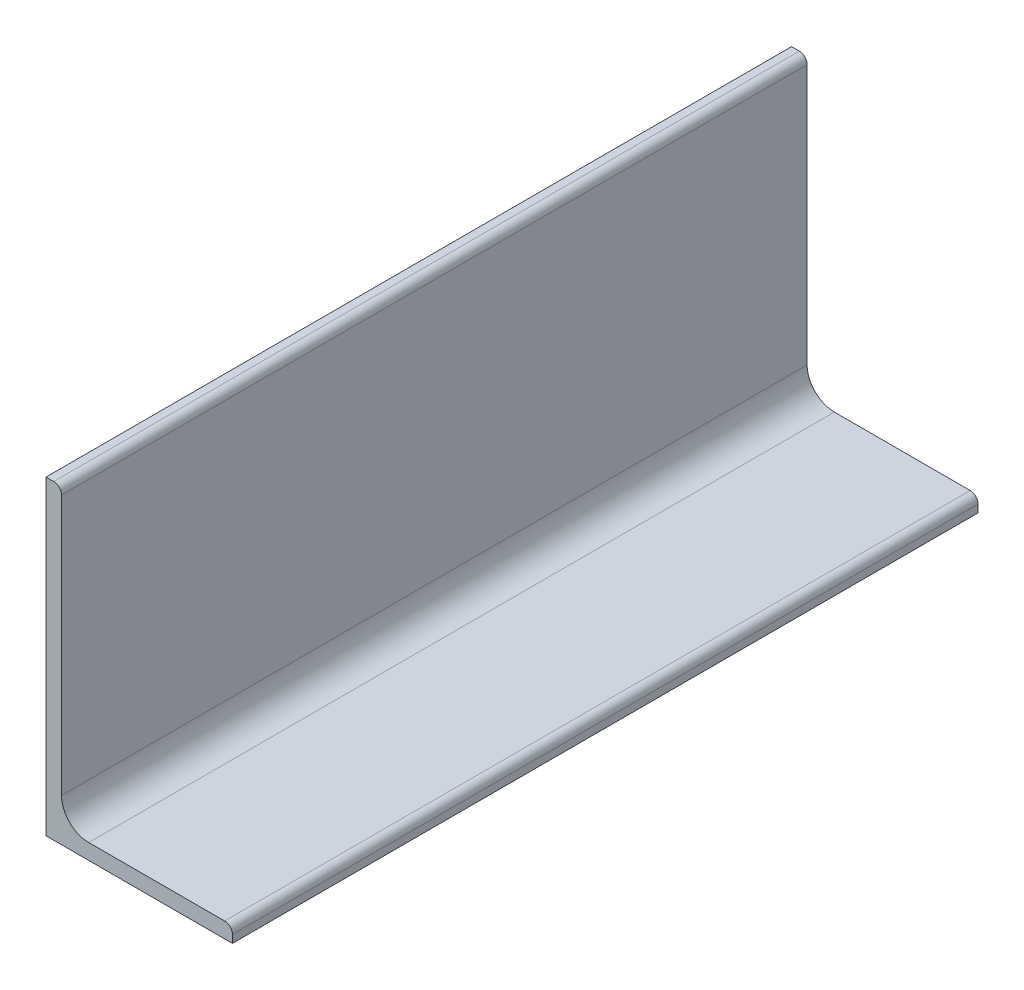
ISO-10303-21;
HEADER;
FILE_DESCRIPTION(('STEP AP214'),'2;1');
FILE_NAME('part.step','',(''),(''),'','','');
FILE_SCHEMA(('AUTOMOTIVE_DESIGN { 1 0 10303 214 1 1 1 1 }'));
ENDSEC;
DATA;
#1=APPLICATION_CONTEXT('core data for automotive mechanical design processes');
#2=APPLICATION_PROTOCOL_DEFINITION('international standard','automotive_design',2000,#1);
#3=PRODUCT_CONTEXT('',#1,'mechanical');
#4=PRODUCT('Part','Part','',(#3));
#5=PRODUCT_RELATED_PRODUCT_CATEGORY('part','',(#4));
#6=PRODUCT_DEFINITION_FORMATION('','',#4);
#7=PRODUCT_DEFINITION_CONTEXT('part definition',#1,'design');
#8=PRODUCT_DEFINITION('design','',#6,#7);
#9=PRODUCT_DEFINITION_SHAPE('','',#8);
#10=(LENGTH_UNIT() NAMED_UNIT(*) SI_UNIT(.MILLI.,.METRE.));
#11=(NAMED_UNIT(*) PLANE_ANGLE_UNIT() SI_UNIT($,.RADIAN.));
#12=(NAMED_UNIT(*) SI_UNIT($,.STERADIAN.) SOLID_ANGLE_UNIT());
#13=UNCERTAINTY_MEASURE_WITH_UNIT(LENGTH_MEASURE(1.E-05),#10,'distance_accuracy_value','');
#14=(GEOMETRIC_REPRESENTATION_CONTEXT(3) GLOBAL_UNCERTAINTY_ASSIGNED_CONTEXT((#13)) GLOBAL_UNIT_ASSIGNED_CONTEXT((#10,
#11,#12)) REPRESENTATION_CONTEXT('',''));
#15=CARTESIAN_POINT('',(0.,0.,0.));
#16=DIRECTION('',(0.,0.,1.));
#17=DIRECTION('',(1.,0.,0.));
#18=AXIS2_PLACEMENT_3D('',#15,#16,#17);
#19=CARTESIAN_POINT('',(0.490776827053332,127.041655270204,304.8));
#20=DIRECTION('',(1.,0.,0.));
#21=DIRECTION('',(0.,0.,-1.));
#22=AXIS2_PLACEMENT_3D('',#19,#20,#21);
#23=PLANE('',#22);
#24=DIRECTION('',(0.,-1.,0.));
#25=VECTOR('',#24,1.);
#26=CARTESIAN_POINT('',(0.490776827053332,127.041655270204,0.));
#27=LINE('',#26,#25);
#28=CARTESIAN_POINT('',(0.490776827053332,127.041655270204,0.));
#29=VERTEX_POINT('',#28);
#30=CARTESIAN_POINT('',(0.490776827053332,0.0416552702040917,0.));
#31=VERTEX_POINT('',#30);
#32=EDGE_CURVE('E136',#29,#31,#27,.T.);
#33=ORIENTED_EDGE('',*,*,#32,.T.);
#34=DIRECTION('',(0.,0.,-1.));
#35=VECTOR('',#34,1.);
#36=CARTESIAN_POINT('',(0.490776827053332,0.0416552702040917,304.8));
#37=LINE('',#36,#35);
#38=CARTESIAN_POINT('',(0.490776827053332,0.0416552702040917,304.8));
#39=VERTEX_POINT('',#38);
#40=EDGE_CURVE('E11',#39,#31,#37,.T.);
#41=ORIENTED_EDGE('',*,*,#40,.F.);
#42=DIRECTION('',(0.,-1.,0.));
#43=VECTOR('',#42,1.);
#44=CARTESIAN_POINT('',(0.490776827053332,127.041655270204,304.8));
#45=LINE('',#44,#43);
#46=CARTESIAN_POINT('',(0.490776827053332,127.041655270204,304.8));
#47=VERTEX_POINT('',#46);
#48=EDGE_CURVE('E152',#47,#39,#45,.T.);
#49=ORIENTED_EDGE('',*,*,#48,.F.);
#50=DIRECTION('',(0.,0.,-1.));
#51=VECTOR('',#50,1.);
#52=CARTESIAN_POINT('',(0.490776827053332,127.041655270204,304.8));
#53=LINE('',#52,#51);
#54=EDGE_CURVE('E132',#47,#29,#53,.T.);
#55=ORIENTED_EDGE('',*,*,#54,.T.);
#56=EDGE_LOOP('',(#33,#41,#49,#55));
#57=FACE_BOUND('',#56,.T.);
#58=ADVANCED_FACE('F34',(#57),#23,.F.);
#59=CARTESIAN_POINT('',(0.490776827053332,0.0416552702040917,304.8));
#60=DIRECTION('',(0.,1.,0.));
#61=DIRECTION('',(0.,0.,1.));
#62=AXIS2_PLACEMENT_3D('',#59,#60,#61);
#63=PLANE('',#62);
#64=DIRECTION('',(1.,0.,0.));
#65=VECTOR('',#64,1.);
#66=CARTESIAN_POINT('',(0.490776827053332,0.0416552702040917,0.));
#67=LINE('',#66,#65);
#68=CARTESIAN_POINT('',(76.6907768270533,0.0416552702040917,0.));
#69=VERTEX_POINT('',#68);
#70=EDGE_CURVE('E139',#31,#69,#67,.T.);
#71=ORIENTED_EDGE('',*,*,#70,.T.);
#72=DIRECTION('',(0.,0.,-1.));
#73=VECTOR('',#72,1.);
#74=CARTESIAN_POINT('',(76.6907768270533,0.0416552702040917,304.8));
#75=LINE('',#74,#73);
#76=CARTESIAN_POINT('',(76.6907768270533,0.0416552702040917,304.8));
#77=VERTEX_POINT('',#76);
#78=EDGE_CURVE('E42',#77,#69,#75,.T.);
#79=ORIENTED_EDGE('',*,*,#78,.F.);
#80=DIRECTION('',(1.,0.,0.));
#81=VECTOR('',#80,1.);
#82=CARTESIAN_POINT('',(0.490776827053332,0.0416552702040917,304.8));
#83=LINE('',#82,#81);
#84=EDGE_CURVE('E96',#39,#77,#83,.T.);
#85=ORIENTED_EDGE('',*,*,#84,.F.);
#86=ORIENTED_EDGE('',*,*,#40,.T.);
#87=EDGE_LOOP('',(#71,#79,#85,#86));
#88=FACE_BOUND('',#87,.T.);
#89=ADVANCED_FACE('F195',(#88),#63,.F.);
#90=CARTESIAN_POINT('',(76.6907768270533,0.0416552702040917,304.8));
#91=DIRECTION('',(-1.,0.,0.));
#92=DIRECTION('',(0.,0.,1.));
#93=AXIS2_PLACEMENT_3D('',#90,#91,#92);
#94=PLANE('',#93);
#95=DIRECTION('',(0.,1.,0.));
#96=VECTOR('',#95,1.);
#97=CARTESIAN_POINT('',(76.6907768270533,0.0416552702040917,0.));
#98=LINE('',#97,#96);
#99=CARTESIAN_POINT('',(76.6907768270533,3.21665527020409,0.));
#100=VERTEX_POINT('',#99);
#101=EDGE_CURVE('E141',#69,#100,#98,.T.);
#102=ORIENTED_EDGE('',*,*,#101,.T.);
#103=DIRECTION('',(0.,0.,-1.));
#104=VECTOR('',#103,1.);
#105=CARTESIAN_POINT('',(76.6907768270533,3.21665527020409,304.8));
#106=LINE('',#105,#104);
#107=CARTESIAN_POINT('',(76.6907768270533,3.21665527020409,304.8));
#108=VERTEX_POINT('',#107);
#109=EDGE_CURVE('E162',#108,#100,#106,.T.);
#110=ORIENTED_EDGE('',*,*,#109,.F.);
#111=DIRECTION('',(0.,1.,0.));
#112=VECTOR('',#111,1.);
#113=CARTESIAN_POINT('',(76.6907768270533,0.0416552702040917,304.8));
#114=LINE('',#113,#112);
#115=EDGE_CURVE('E170',#77,#108,#114,.T.);
#116=ORIENTED_EDGE('',*,*,#115,.F.);
#117=ORIENTED_EDGE('',*,*,#78,.T.);
#118=EDGE_LOOP('',(#102,#110,#116,#117));
#119=FACE_BOUND('',#118,.T.);
#120=ADVANCED_FACE('F168',(#119),#94,.F.);
#121=CARTESIAN_POINT('',(73.5157768270533,3.21665527020409,304.8));
#122=DIRECTION('',(0.,0.,-1.));
#123=DIRECTION('',(-1.,0.,0.));
#124=AXIS2_PLACEMENT_3D('',#121,#122,#123);
#125=CYLINDRICAL_SURFACE('',#124,3.175);
#126=CARTESIAN_POINT('',(73.5157768270533,3.21665527020409,0.));
#127=DIRECTION('',(0.,0.,1.));
#128=DIRECTION('',(1.,0.,0.));
#129=AXIS2_PLACEMENT_3D('',#126,#127,#128);
#130=CIRCLE('',#129,3.175);
#131=CARTESIAN_POINT('',(73.5157768270533,6.39165527020409,0.));
#132=VERTEX_POINT('',#131);
#133=EDGE_CURVE('E143',#100,#132,#130,.T.);
#134=ORIENTED_EDGE('',*,*,#133,.T.);
#135=DIRECTION('',(0.,0.,-1.));
#136=VECTOR('',#135,1.);
#137=CARTESIAN_POINT('',(73.5157768270533,6.39165527020409,304.8));
#138=LINE('',#137,#136);
#139=CARTESIAN_POINT('',(73.5157768270533,6.39165527020409,304.8));
#140=VERTEX_POINT('',#139);
#141=EDGE_CURVE('E159',#140,#132,#138,.T.);
#142=ORIENTED_EDGE('',*,*,#141,.F.);
#143=CARTESIAN_POINT('',(73.5157768270533,3.21665527020409,304.8));
#144=DIRECTION('',(0.,0.,1.));
#145=DIRECTION('',(1.,0.,0.));
#146=AXIS2_PLACEMENT_3D('',#143,#144,#145);
#147=CIRCLE('',#146,3.175);
#148=EDGE_CURVE('E186',#108,#140,#147,.T.);
#149=ORIENTED_EDGE('',*,*,#148,.F.);
#150=ORIENTED_EDGE('',*,*,#109,.T.);
#151=EDGE_LOOP('',(#134,#142,#149,#150));
#152=FACE_BOUND('',#151,.T.);
#153=ADVANCED_FACE('F179',(#152),#125,.T.);
#154=CARTESIAN_POINT('',(73.5157768270533,6.39165527020409,304.8));
#155=DIRECTION('',(0.,-1.,0.));
#156=DIRECTION('',(0.,0.,-1.));
#157=AXIS2_PLACEMENT_3D('',#154,#155,#156);
#158=PLANE('',#157);
#159=DIRECTION('',(-1.,0.,0.));
#160=VECTOR('',#159,1.);
#161=CARTESIAN_POINT('',(73.5157768270533,6.39165527020409,0.));
#162=LINE('',#161,#160);
#163=CARTESIAN_POINT('',(17.9532768270533,6.39165527020409,0.));
#164=VERTEX_POINT('',#163);
#165=EDGE_CURVE('E145',#132,#164,#162,.T.);
#166=ORIENTED_EDGE('',*,*,#165,.T.);
#167=DIRECTION('',(0.,0.,-1.));
#168=VECTOR('',#167,1.);
#169=CARTESIAN_POINT('',(17.9532768270533,6.39165527020409,304.8));
#170=LINE('',#169,#168);
#171=CARTESIAN_POINT('',(17.9532768270533,6.39165527020409,304.8));
#172=VERTEX_POINT('',#171);
#173=EDGE_CURVE('E156',#172,#164,#170,.T.);
#174=ORIENTED_EDGE('',*,*,#173,.F.);
#175=DIRECTION('',(-1.,0.,0.));
#176=VECTOR('',#175,1.);
#177=CARTESIAN_POINT('',(73.5157768270533,6.39165527020409,304.8));
#178=LINE('',#177,#176);
#179=EDGE_CURVE('E185',#140,#172,#178,.T.);
#180=ORIENTED_EDGE('',*,*,#179,.F.);
#181=ORIENTED_EDGE('',*,*,#141,.T.);
#182=EDGE_LOOP('',(#166,#174,#180,#181));
#183=FACE_BOUND('',#182,.T.);
#184=ADVANCED_FACE('F183',(#183),#158,.F.);
#185=CARTESIAN_POINT('',(17.9532768270533,17.5041552702041,304.8));
#186=DIRECTION('',(0.,0.,-1.));
#187=DIRECTION('',(-1.,0.,0.));
#188=AXIS2_PLACEMENT_3D('',#185,#186,#187);
#189=CYLINDRICAL_SURFACE('',#188,11.1125);
#190=CARTESIAN_POINT('',(17.9532768270533,17.5041552702041,0.));
#191=DIRECTION('',(0.,0.,-1.));
#192=DIRECTION('',(1.,0.,0.));
#193=AXIS2_PLACEMENT_3D('',#190,#191,#192);
#194=CIRCLE('',#193,11.1125);
#195=CARTESIAN_POINT('',(6.84077682705333,17.5041552702041,0.));
#196=VERTEX_POINT('',#195);
#197=EDGE_CURVE('E147',#164,#196,#194,.T.);
#198=ORIENTED_EDGE('',*,*,#197,.T.);
#199=DIRECTION('',(0.,0.,-1.));
#200=VECTOR('',#199,1.);
#201=CARTESIAN_POINT('',(6.84077682705333,17.5041552702041,304.8));
#202=LINE('',#201,#200);
#203=CARTESIAN_POINT('',(6.84077682705333,17.5041552702041,304.8));
#204=VERTEX_POINT('',#203);
#205=EDGE_CURVE('E127',#204,#196,#202,.T.);
#206=ORIENTED_EDGE('',*,*,#205,.F.);
#207=CARTESIAN_POINT('',(17.9532768270533,17.5041552702041,304.8));
#208=DIRECTION('',(0.,0.,-1.));
#209=DIRECTION('',(1.,0.,0.));
#210=AXIS2_PLACEMENT_3D('',#207,#208,#209);
#211=CIRCLE('',#210,11.1125);
#212=EDGE_CURVE('E118',#172,#204,#211,.T.);
#213=ORIENTED_EDGE('',*,*,#212,.F.);
#214=ORIENTED_EDGE('',*,*,#173,.T.);
#215=EDGE_LOOP('',(#198,#206,#213,#214));
#216=FACE_BOUND('',#215,.T.);
#217=ADVANCED_FACE('F207',(#216),#189,.F.);
#218=CARTESIAN_POINT('',(6.84077682705333,17.5041552702041,304.8));
#219=DIRECTION('',(-1.,0.,0.));
#220=DIRECTION('',(0.,0.,1.));
#221=AXIS2_PLACEMENT_3D('',#218,#219,#220);
#222=PLANE('',#221);
#223=DIRECTION('',(0.,1.,0.));
#224=VECTOR('',#223,1.);
#225=CARTESIAN_POINT('',(6.84077682705333,17.5041552702041,0.));
#226=LINE('',#225,#224);
#227=CARTESIAN_POINT('',(6.84077682705333,123.866655270204,0.));
#228=VERTEX_POINT('',#227);
#229=EDGE_CURVE('E126',#196,#228,#226,.T.);
#230=ORIENTED_EDGE('',*,*,#229,.T.);
#231=DIRECTION('',(0.,0.,-1.));
#232=VECTOR('',#231,1.);
#233=CARTESIAN_POINT('',(6.84077682705333,123.866655270204,304.8));
#234=LINE('',#233,#232);
#235=CARTESIAN_POINT('',(6.84077682705333,123.866655270204,304.8));
#236=VERTEX_POINT('',#235);
#237=EDGE_CURVE('E123',#236,#228,#234,.T.);
#238=ORIENTED_EDGE('',*,*,#237,.F.);
#239=DIRECTION('',(0.,1.,0.));
#240=VECTOR('',#239,1.);
#241=CARTESIAN_POINT('',(6.84077682705333,17.5041552702041,304.8));
#242=LINE('',#241,#240);
#243=EDGE_CURVE('E112',#204,#236,#242,.T.);
#244=ORIENTED_EDGE('',*,*,#243,.F.);
#245=ORIENTED_EDGE('',*,*,#205,.T.);
#246=EDGE_LOOP('',(#230,#238,#244,#245));
#247=FACE_BOUND('',#246,.T.);
#248=ADVANCED_FACE('F124',(#247),#222,.F.);
#249=CARTESIAN_POINT('',(3.66577682705334,123.866655270204,304.8));
#250=DIRECTION('',(0.,0.,-1.));
#251=DIRECTION('',(-1.,0.,0.));
#252=AXIS2_PLACEMENT_3D('',#249,#250,#251);
#253=CYLINDRICAL_SURFACE('',#252,3.175);
#254=CARTESIAN_POINT('',(3.66577682705334,123.866655270204,0.));
#255=DIRECTION('',(0.,0.,1.));
#256=DIRECTION('',(1.,0.,0.));
#257=AXIS2_PLACEMENT_3D('',#254,#255,#256);
#258=CIRCLE('',#257,3.175);
#259=CARTESIAN_POINT('',(3.66577682705333,127.041655270204,0.));
#260=VERTEX_POINT('',#259);
#261=EDGE_CURVE('E82',#228,#260,#258,.T.);
#262=ORIENTED_EDGE('',*,*,#261,.T.);
#263=DIRECTION('',(0.,0.,-1.));
#264=VECTOR('',#263,1.);
#265=CARTESIAN_POINT('',(3.66577682705333,127.041655270204,304.8));
#266=LINE('',#265,#264);
#267=CARTESIAN_POINT('',(3.66577682705333,127.041655270204,304.8));
#268=VERTEX_POINT('',#267);
#269=EDGE_CURVE('E128',#268,#260,#266,.T.);
#270=ORIENTED_EDGE('',*,*,#269,.F.);
#271=CARTESIAN_POINT('',(3.66577682705334,123.866655270204,304.8));
#272=DIRECTION('',(0.,0.,1.));
#273=DIRECTION('',(1.,0.,0.));
#274=AXIS2_PLACEMENT_3D('',#271,#272,#273);
#275=CIRCLE('',#274,3.175);
#276=EDGE_CURVE('E116',#236,#268,#275,.T.);
#277=ORIENTED_EDGE('',*,*,#276,.F.);
#278=ORIENTED_EDGE('',*,*,#237,.T.);
#279=EDGE_LOOP('',(#262,#270,#277,#278));
#280=FACE_BOUND('',#279,.T.);
#281=ADVANCED_FACE('F130',(#280),#253,.T.);
#282=CARTESIAN_POINT('',(3.66577682705333,127.041655270204,304.8));
#283=DIRECTION('',(0.,-1.,0.));
#284=DIRECTION('',(0.,0.,-1.));
#285=AXIS2_PLACEMENT_3D('',#282,#283,#284);
#286=PLANE('',#285);
#287=DIRECTION('',(-1.,0.,0.));
#288=VECTOR('',#287,1.);
#289=CARTESIAN_POINT('',(3.66577682705333,127.041655270204,0.));
#290=LINE('',#289,#288);
#291=EDGE_CURVE('E88',#260,#29,#290,.T.);
#292=ORIENTED_EDGE('',*,*,#291,.T.);
#293=ORIENTED_EDGE('',*,*,#54,.F.);
#294=DIRECTION('',(-1.,0.,0.));
#295=VECTOR('',#294,1.);
#296=CARTESIAN_POINT('',(3.66577682705333,127.041655270204,304.8));
#297=LINE('',#296,#295);
#298=EDGE_CURVE('E50',#268,#47,#297,.T.);
#299=ORIENTED_EDGE('',*,*,#298,.F.);
#300=ORIENTED_EDGE('',*,*,#269,.T.);
#301=EDGE_LOOP('',(#292,#293,#299,#300));
#302=FACE_BOUND('',#301,.T.);
#303=ADVANCED_FACE('F215',(#302),#286,.F.);
#304=CARTESIAN_POINT('',(73.5157768270533,3.21665527020409,304.8));
#305=DIRECTION('',(0.,0.,1.));
#306=DIRECTION('',(1.,0.,0.));
#307=AXIS2_PLACEMENT_3D('',#304,#305,#306);
#308=PLANE('',#307);
#309=ORIENTED_EDGE('',*,*,#48,.T.);
#310=ORIENTED_EDGE('',*,*,#84,.T.);
#311=ORIENTED_EDGE('',*,*,#115,.T.);
#312=ORIENTED_EDGE('',*,*,#148,.T.);
#313=ORIENTED_EDGE('',*,*,#179,.T.);
#314=ORIENTED_EDGE('',*,*,#212,.T.);
#315=ORIENTED_EDGE('',*,*,#243,.T.);
#316=ORIENTED_EDGE('',*,*,#276,.T.);
#317=ORIENTED_EDGE('',*,*,#298,.T.);
#318=EDGE_LOOP('',(#309,#310,#311,#312,#313,#314,#315,#316,#317));
#319=FACE_BOUND('',#318,.T.);
#320=ADVANCED_FACE('F114',(#319),#308,.T.);
#321=CARTESIAN_POINT('',(73.5157768270533,3.21665527020409,0.));
#322=DIRECTION('',(0.,0.,1.));
#323=DIRECTION('',(1.,0.,0.));
#324=AXIS2_PLACEMENT_3D('',#321,#322,#323);
#325=PLANE('',#324);
#326=ORIENTED_EDGE('',*,*,#32,.F.);
#327=ORIENTED_EDGE('',*,*,#291,.F.);
#328=ORIENTED_EDGE('',*,*,#261,.F.);
#329=ORIENTED_EDGE('',*,*,#229,.F.);
#330=ORIENTED_EDGE('',*,*,#197,.F.);
#331=ORIENTED_EDGE('',*,*,#165,.F.);
#332=ORIENTED_EDGE('',*,*,#133,.F.);
#333=ORIENTED_EDGE('',*,*,#101,.F.);
#334=ORIENTED_EDGE('',*,*,#70,.F.);
#335=EDGE_LOOP('',(#326,#327,#328,#329,#330,#331,#332,#333,#334));
#336=FACE_BOUND('',#335,.T.);
#337=ADVANCED_FACE('F174',(#336),#325,.F.);
#338=CLOSED_SHELL('',(#58,#89,#120,#153,#184,#217,#248,#281,#303,#320,#337));
#339=MANIFOLD_SOLID_BREP('B2',#338);
#340=ADVANCED_BREP_SHAPE_REPRESENTATION('',(#18,#339),#14);
#341=SHAPE_DEFINITION_REPRESENTATION(#9,#340);
ENDSEC;
END-ISO-10303-21;
